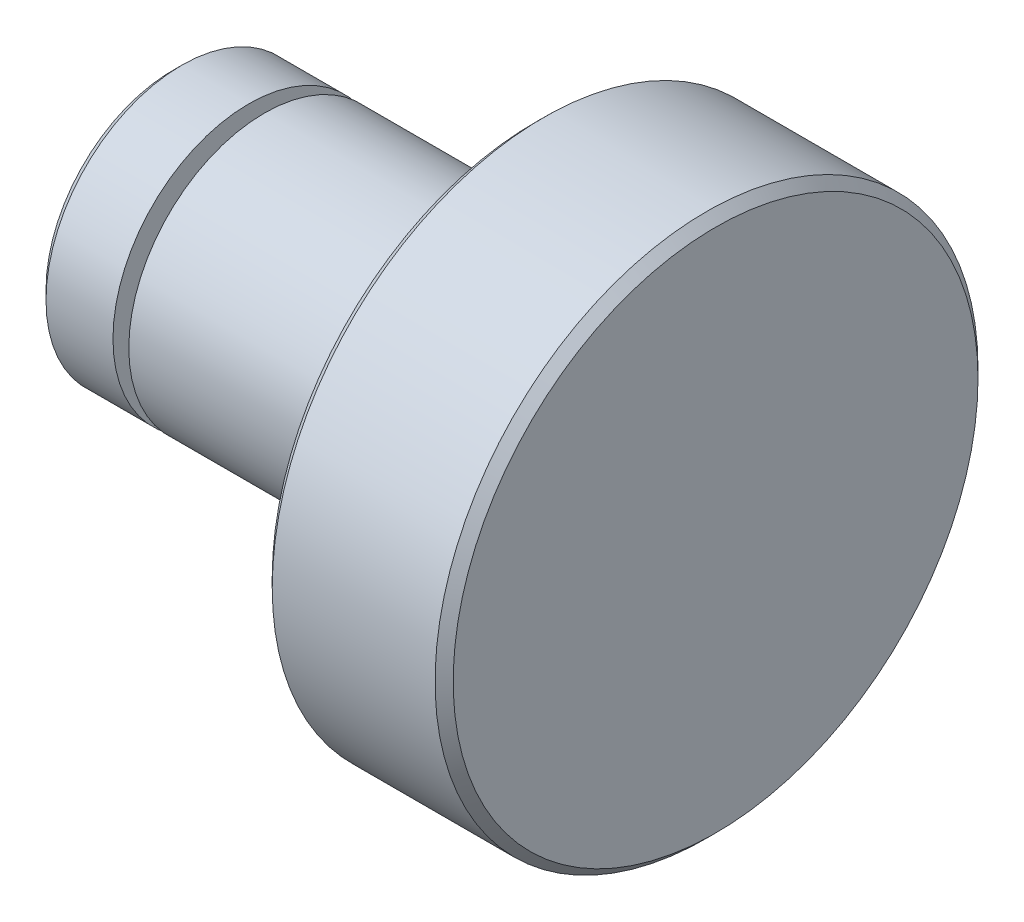
ISO-10303-21;
HEADER;
FILE_DESCRIPTION(('STEP AP214'),'2;1');
FILE_NAME('part.step','',(''),(''),'','','');
FILE_SCHEMA(('AUTOMOTIVE_DESIGN { 1 0 10303 214 1 1 1 1 }'));
ENDSEC;
DATA;
#1=APPLICATION_CONTEXT('core data for automotive mechanical design processes');
#2=APPLICATION_PROTOCOL_DEFINITION('international standard','automotive_design',2000,#1);
#3=PRODUCT_CONTEXT('',#1,'mechanical');
#4=PRODUCT('Part','Part','',(#3));
#5=PRODUCT_RELATED_PRODUCT_CATEGORY('part','',(#4));
#6=PRODUCT_DEFINITION_FORMATION('','',#4);
#7=PRODUCT_DEFINITION_CONTEXT('part definition',#1,'design');
#8=PRODUCT_DEFINITION('design','',#6,#7);
#9=PRODUCT_DEFINITION_SHAPE('','',#8);
#10=(LENGTH_UNIT() NAMED_UNIT(*) SI_UNIT(.MILLI.,.METRE.));
#11=(NAMED_UNIT(*) PLANE_ANGLE_UNIT() SI_UNIT($,.RADIAN.));
#12=(NAMED_UNIT(*) SI_UNIT($,.STERADIAN.) SOLID_ANGLE_UNIT());
#13=UNCERTAINTY_MEASURE_WITH_UNIT(LENGTH_MEASURE(1.E-05),#10,'distance_accuracy_value','');
#14=(GEOMETRIC_REPRESENTATION_CONTEXT(3) GLOBAL_UNCERTAINTY_ASSIGNED_CONTEXT((#13)) GLOBAL_UNIT_ASSIGNED_CONTEXT((#10,
#11,#12)) REPRESENTATION_CONTEXT('',''));
#15=CARTESIAN_POINT('',(0.,0.,0.));
#16=DIRECTION('',(0.,0.,1.));
#17=DIRECTION('',(1.,0.,0.));
#18=AXIS2_PLACEMENT_3D('',#15,#16,#17);
#19=CARTESIAN_POINT('',(0.,0.,0.));
#20=DIRECTION('',(1.,0.,0.));
#21=DIRECTION('',(0.,0.,-1.));
#22=AXIS2_PLACEMENT_3D('',#19,#20,#21);
#23=PLANE('',#22);
#24=CARTESIAN_POINT('',(0.,0.,0.));
#25=DIRECTION('',(1.,0.,0.));
#26=DIRECTION('',(0.,0.,-1.));
#27=AXIS2_PLACEMENT_3D('',#24,#25,#26);
#28=CIRCLE('',#27,29.);
#29=CARTESIAN_POINT('',(0.,0.,-29.));
#30=VERTEX_POINT('',#29);
#31=EDGE_CURVE('E10',#30,#30,#28,.T.);
#32=ORIENTED_EDGE('',*,*,#31,.T.);
#33=EDGE_LOOP('',(#32));
#34=FACE_BOUND('',#33,.T.);
#35=ADVANCED_FACE('F38',(#34),#23,.T.);
#36=CARTESIAN_POINT('',(0.,0.,0.));
#37=DIRECTION('',(1.,0.,0.));
#38=DIRECTION('',(0.,0.,-1.));
#39=AXIS2_PLACEMENT_3D('',#36,#37,#38);
#40=CYLINDRICAL_SURFACE('',#39,30.);
#41=CARTESIAN_POINT('',(-19.,0.,0.));
#42=DIRECTION('',(-1.,0.,0.));
#43=DIRECTION('',(0.,0.,1.));
#44=AXIS2_PLACEMENT_3D('',#41,#42,#43);
#45=CIRCLE('',#44,30.);
#46=CARTESIAN_POINT('',(-19.,0.,30.));
#47=VERTEX_POINT('',#46);
#48=EDGE_CURVE('E63',#47,#47,#45,.F.);
#49=ORIENTED_EDGE('',*,*,#48,.T.);
#50=EDGE_LOOP('',(#49));
#51=FACE_BOUND('',#50,.T.);
#52=CARTESIAN_POINT('',(-1.00000000000001,0.,0.));
#53=DIRECTION('',(1.,0.,0.));
#54=DIRECTION('',(0.,0.,-1.));
#55=AXIS2_PLACEMENT_3D('',#52,#53,#54);
#56=CIRCLE('',#55,30.);
#57=CARTESIAN_POINT('',(-1.00000000000001,0.,-30.));
#58=VERTEX_POINT('',#57);
#59=EDGE_CURVE('E67',#58,#58,#56,.F.);
#60=ORIENTED_EDGE('',*,*,#59,.T.);
#61=EDGE_LOOP('',(#60));
#62=FACE_BOUND('',#61,.T.);
#63=ADVANCED_FACE('F113',(#51,#62),#40,.T.);
#64=CARTESIAN_POINT('',(-20.,30.,0.));
#65=DIRECTION('',(-1.,0.,0.));
#66=DIRECTION('',(0.,0.,1.));
#67=AXIS2_PLACEMENT_3D('',#64,#65,#66);
#68=PLANE('',#67);
#69=CARTESIAN_POINT('',(-20.,0.,0.));
#70=DIRECTION('',(-1.,0.,0.));
#71=DIRECTION('',(0.,0.,1.));
#72=AXIS2_PLACEMENT_3D('',#69,#70,#71);
#73=CIRCLE('',#72,29.);
#74=CARTESIAN_POINT('',(-20.,0.,29.));
#75=VERTEX_POINT('',#74);
#76=EDGE_CURVE('E57',#75,#75,#73,.T.);
#77=ORIENTED_EDGE('',*,*,#76,.T.);
#78=EDGE_LOOP('',(#77));
#79=FACE_BOUND('',#78,.T.);
#80=CARTESIAN_POINT('',(-20.,0.,0.));
#81=DIRECTION('',(1.,0.,0.));
#82=DIRECTION('',(0.,0.,-1.));
#83=AXIS2_PLACEMENT_3D('',#80,#81,#82);
#84=CIRCLE('',#83,15.);
#85=CARTESIAN_POINT('',(-20.,0.,-15.));
#86=VERTEX_POINT('',#85);
#87=EDGE_CURVE('E71',#86,#86,#84,.T.);
#88=ORIENTED_EDGE('',*,*,#87,.T.);
#89=EDGE_LOOP('',(#88));
#90=FACE_BOUND('',#89,.T.);
#91=ADVANCED_FACE('F118',(#79,#90),#68,.T.);
#92=CARTESIAN_POINT('',(0.,0.,0.));
#93=DIRECTION('',(1.,0.,0.));
#94=DIRECTION('',(0.,0.,-1.));
#95=AXIS2_PLACEMENT_3D('',#92,#93,#94);
#96=CYLINDRICAL_SURFACE('',#95,15.);
#97=CARTESIAN_POINT('',(-49.85,0.,0.));
#98=DIRECTION('',(1.,0.,0.));
#99=DIRECTION('',(0.,0.,-1.));
#100=AXIS2_PLACEMENT_3D('',#97,#98,#99);
#101=CIRCLE('',#100,15.);
#102=CARTESIAN_POINT('',(-49.85,0.,-15.));
#103=VERTEX_POINT('',#102);
#104=EDGE_CURVE('E87',#103,#103,#101,.T.);
#105=ORIENTED_EDGE('',*,*,#104,.T.);
#106=EDGE_LOOP('',(#105));
#107=FACE_BOUND('',#106,.T.);
#108=ORIENTED_EDGE('',*,*,#87,.F.);
#109=EDGE_LOOP('',(#108));
#110=FACE_BOUND('',#109,.T.);
#111=ADVANCED_FACE('F92',(#107,#110),#96,.T.);
#112=CARTESIAN_POINT('',(-19.,0.,0.));
#113=DIRECTION('',(1.,0.,0.));
#114=DIRECTION('',(0.,0.,-1.));
#115=AXIS2_PLACEMENT_3D('',#112,#113,#114);
#116=CONICAL_SURFACE('',#115,30.,0.78539816339745);
#117=ORIENTED_EDGE('',*,*,#76,.F.);
#118=EDGE_LOOP('',(#117));
#119=FACE_BOUND('',#118,.T.);
#120=ORIENTED_EDGE('',*,*,#48,.F.);
#121=EDGE_LOOP('',(#120));
#122=FACE_BOUND('',#121,.T.);
#123=ADVANCED_FACE('F124',(#119,#122),#116,.T.);
#124=CARTESIAN_POINT('',(0.,0.,0.));
#125=DIRECTION('',(-1.,0.,0.));
#126=DIRECTION('',(0.,0.,1.));
#127=AXIS2_PLACEMENT_3D('',#124,#125,#126);
#128=CONICAL_SURFACE('',#127,29.,0.785398163397453);
#129=ORIENTED_EDGE('',*,*,#59,.F.);
#130=EDGE_LOOP('',(#129));
#131=FACE_BOUND('',#130,.T.);
#132=ORIENTED_EDGE('',*,*,#31,.F.);
#133=EDGE_LOOP('',(#132));
#134=FACE_BOUND('',#133,.T.);
#135=ADVANCED_FACE('F41',(#131,#134),#128,.T.);
#136=CARTESIAN_POINT('',(-51.6,0.,0.));
#137=DIRECTION('',(-1.,0.,0.));
#138=DIRECTION('',(0.,0.,1.));
#139=AXIS2_PLACEMENT_3D('',#136,#137,#138);
#140=PLANE('',#139);
#141=CARTESIAN_POINT('',(-51.6,0.,0.));
#142=DIRECTION('',(1.,0.,0.));
#143=DIRECTION('',(0.,0.,-1.));
#144=AXIS2_PLACEMENT_3D('',#141,#142,#143);
#145=CIRCLE('',#144,12.);
#146=CARTESIAN_POINT('',(-51.6,0.,-12.));
#147=VERTEX_POINT('',#146);
#148=EDGE_CURVE('E79',#147,#147,#145,.T.);
#149=ORIENTED_EDGE('',*,*,#148,.F.);
#150=EDGE_LOOP('',(#149));
#151=FACE_BOUND('',#150,.T.);
#152=CARTESIAN_POINT('',(-51.6,0.,0.));
#153=DIRECTION('',(1.,0.,0.));
#154=DIRECTION('',(0.,0.,-1.));
#155=AXIS2_PLACEMENT_3D('',#152,#153,#154);
#156=CIRCLE('',#155,15.);
#157=CARTESIAN_POINT('',(-51.6,0.,-15.));
#158=VERTEX_POINT('',#157);
#159=EDGE_CURVE('E75',#158,#158,#156,.T.);
#160=ORIENTED_EDGE('',*,*,#159,.T.);
#161=EDGE_LOOP('',(#160));
#162=FACE_BOUND('',#161,.T.);
#163=ADVANCED_FACE('F104',(#151,#162),#140,.F.);
#164=CARTESIAN_POINT('',(0.,0.,0.));
#165=DIRECTION('',(1.,0.,0.));
#166=DIRECTION('',(0.,0.,-1.));
#167=AXIS2_PLACEMENT_3D('',#164,#165,#166);
#168=CYLINDRICAL_SURFACE('',#167,12.);
#169=ORIENTED_EDGE('',*,*,#148,.T.);
#170=EDGE_LOOP('',(#169));
#171=FACE_BOUND('',#170,.T.);
#172=CARTESIAN_POINT('',(-49.85,0.,0.));
#173=DIRECTION('',(1.,0.,0.));
#174=DIRECTION('',(0.,0.,-1.));
#175=AXIS2_PLACEMENT_3D('',#172,#173,#174);
#176=CIRCLE('',#175,12.);
#177=CARTESIAN_POINT('',(-49.85,0.,-12.));
#178=VERTEX_POINT('',#177);
#179=EDGE_CURVE('E83',#178,#178,#176,.T.);
#180=ORIENTED_EDGE('',*,*,#179,.F.);
#181=EDGE_LOOP('',(#180));
#182=FACE_BOUND('',#181,.T.);
#183=ADVANCED_FACE('F99',(#171,#182),#168,.T.);
#184=CARTESIAN_POINT('',(-49.85,0.,0.));
#185=DIRECTION('',(1.,0.,0.));
#186=DIRECTION('',(0.,0.,-1.));
#187=AXIS2_PLACEMENT_3D('',#184,#185,#186);
#188=PLANE('',#187);
#189=ORIENTED_EDGE('',*,*,#104,.F.);
#190=EDGE_LOOP('',(#189));
#191=FACE_BOUND('',#190,.T.);
#192=ORIENTED_EDGE('',*,*,#179,.T.);
#193=EDGE_LOOP('',(#192));
#194=FACE_BOUND('',#193,.T.);
#195=ADVANCED_FACE('F95',(#191,#194),#188,.F.);
#196=CARTESIAN_POINT('',(-60.,15.,0.));
#197=DIRECTION('',(-1.,0.,0.));
#198=DIRECTION('',(0.,0.,1.));
#199=AXIS2_PLACEMENT_3D('',#196,#197,#198);
#200=PLANE('',#199);
#201=CARTESIAN_POINT('',(-60.,0.,0.));
#202=DIRECTION('',(-1.,0.,0.));
#203=DIRECTION('',(0.,0.,1.));
#204=AXIS2_PLACEMENT_3D('',#201,#202,#203);
#205=CIRCLE('',#204,14.);
#206=CARTESIAN_POINT('',(-60.,0.,14.));
#207=VERTEX_POINT('',#206);
#208=EDGE_CURVE('E47',#207,#207,#205,.T.);
#209=ORIENTED_EDGE('',*,*,#208,.T.);
#210=EDGE_LOOP('',(#209));
#211=FACE_BOUND('',#210,.T.);
#212=ADVANCED_FACE('F98',(#211),#200,.T.);
#213=CARTESIAN_POINT('',(-59.,0.,0.));
#214=DIRECTION('',(1.,0.,0.));
#215=DIRECTION('',(0.,0.,-1.));
#216=AXIS2_PLACEMENT_3D('',#213,#214,#215);
#217=CONICAL_SURFACE('',#216,15.,0.785398163397447);
#218=ORIENTED_EDGE('',*,*,#208,.F.);
#219=EDGE_LOOP('',(#218));
#220=FACE_BOUND('',#219,.T.);
#221=CARTESIAN_POINT('',(-59.,0.,0.));
#222=DIRECTION('',(-1.,0.,0.));
#223=DIRECTION('',(0.,0.,1.));
#224=AXIS2_PLACEMENT_3D('',#221,#222,#223);
#225=CIRCLE('',#224,15.);
#226=CARTESIAN_POINT('',(-59.,0.,15.));
#227=VERTEX_POINT('',#226);
#228=EDGE_CURVE('E52',#227,#227,#225,.F.);
#229=ORIENTED_EDGE('',*,*,#228,.F.);
#230=EDGE_LOOP('',(#229));
#231=FACE_BOUND('',#230,.T.);
#232=ADVANCED_FACE('F130',(#220,#231),#217,.T.);
#233=ORIENTED_EDGE('',*,*,#159,.F.);
#234=EDGE_LOOP('',(#233));
#235=FACE_BOUND('',#234,.T.);
#236=ORIENTED_EDGE('',*,*,#228,.T.);
#237=EDGE_LOOP('',(#236));
#238=FACE_BOUND('',#237,.T.);
#239=ADVANCED_FACE('F134',(#235,#238),#96,.T.);
#240=CLOSED_SHELL('',(#35,#63,#91,#111,#123,#135,#163,#183,#195,#212,#232,#239));
#241=MANIFOLD_SOLID_BREP('B2',#240);
#242=ADVANCED_BREP_SHAPE_REPRESENTATION('',(#18,#241),#14);
#243=SHAPE_DEFINITION_REPRESENTATION(#9,#242);
ENDSEC;
END-ISO-10303-21;
